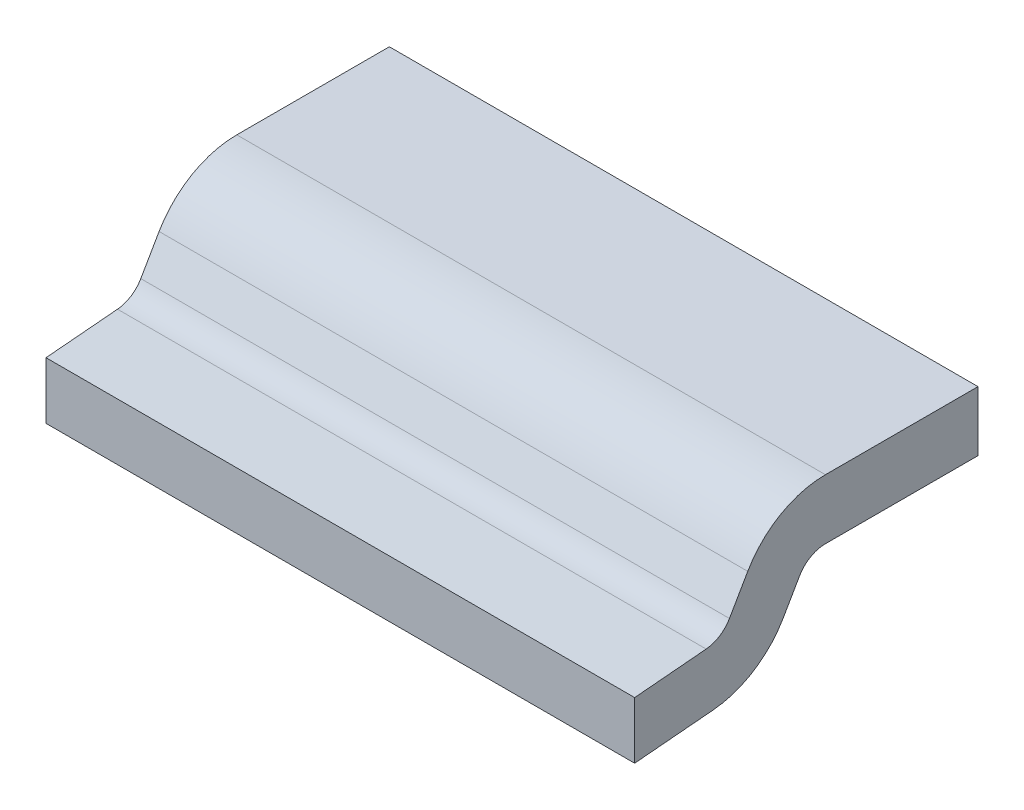
ISO-10303-21;
HEADER;
FILE_DESCRIPTION(('STEP AP214'),'2;1');
FILE_NAME('part.step','',(''),(''),'','','');
FILE_SCHEMA(('AUTOMOTIVE_DESIGN { 1 0 10303 214 1 1 1 1 }'));
ENDSEC;
DATA;
#1=APPLICATION_CONTEXT('core data for automotive mechanical design processes');
#2=APPLICATION_PROTOCOL_DEFINITION('international standard','automotive_design',2000,#1);
#3=PRODUCT_CONTEXT('',#1,'mechanical');
#4=PRODUCT('Part','Part','',(#3));
#5=PRODUCT_RELATED_PRODUCT_CATEGORY('part','',(#4));
#6=PRODUCT_DEFINITION_FORMATION('','',#4);
#7=PRODUCT_DEFINITION_CONTEXT('part definition',#1,'design');
#8=PRODUCT_DEFINITION('design','',#6,#7);
#9=PRODUCT_DEFINITION_SHAPE('','',#8);
#10=(LENGTH_UNIT() NAMED_UNIT(*) SI_UNIT(.MILLI.,.METRE.));
#11=(NAMED_UNIT(*) PLANE_ANGLE_UNIT() SI_UNIT($,.RADIAN.));
#12=(NAMED_UNIT(*) SI_UNIT($,.STERADIAN.) SOLID_ANGLE_UNIT());
#13=UNCERTAINTY_MEASURE_WITH_UNIT(LENGTH_MEASURE(1.E-05),#10,'distance_accuracy_value','');
#14=(GEOMETRIC_REPRESENTATION_CONTEXT(3) GLOBAL_UNCERTAINTY_ASSIGNED_CONTEXT((#13)) GLOBAL_UNIT_ASSIGNED_CONTEXT((#10,
#11,#12)) REPRESENTATION_CONTEXT('',''));
#15=CARTESIAN_POINT('',(0.,0.,0.));
#16=DIRECTION('',(0.,0.,1.));
#17=DIRECTION('',(1.,0.,0.));
#18=AXIS2_PLACEMENT_3D('',#15,#16,#17);
#19=CARTESIAN_POINT('',(-1.5,0.223608840880857,0.398828461671254));
#20=DIRECTION('',(1.,0.,0.));
#21=DIRECTION('',(0.,-0.843391445812889,-0.537299608346818));
#22=AXIS2_PLACEMENT_3D('',#19,#20,#21);
#23=CYLINDRICAL_SURFACE('',#22,0.1524);
#24=CARTESIAN_POINT('',(-1.5,0.223608840880857,0.398828461671254));
#25=DIRECTION('',(-1.,0.,0.));
#26=DIRECTION('',(0.,-0.843391445812889,-0.537299608346818));
#27=AXIS2_PLACEMENT_3D('',#24,#25,#26);
#28=CIRCLE('',#27,0.1524);
#29=CARTESIAN_POINT('',(-1.5,0.147408840880837,0.266846190134476));
#30=VERTEX_POINT('',#29);
#31=CARTESIAN_POINT('',(-1.5,0.0717887688916677,0.385545926476509));
#32=VERTEX_POINT('',#31);
#33=EDGE_CURVE('E11',#30,#32,#28,.T.);
#34=ORIENTED_EDGE('',*,*,#33,.T.);
#35=DIRECTION('',(1.,0.,0.));
#36=VECTOR('',#35,1.);
#37=CARTESIAN_POINT('',(-1.5,0.0717887688916754,0.38554592647651));
#38=LINE('',#37,#36);
#39=CARTESIAN_POINT('',(1.5,0.0717887688916677,0.385545926476509));
#40=VERTEX_POINT('',#39);
#41=EDGE_CURVE('E24',#32,#40,#38,.T.);
#42=ORIENTED_EDGE('',*,*,#41,.T.);
#43=CARTESIAN_POINT('',(1.5,0.223608840880857,0.398828461671254));
#44=DIRECTION('',(1.,0.,0.));
#45=DIRECTION('',(0.,-0.843391445812889,-0.537299608346818));
#46=AXIS2_PLACEMENT_3D('',#43,#44,#45);
#47=CIRCLE('',#46,0.1524);
#48=CARTESIAN_POINT('',(1.5,0.147408840880838,0.266846190134478));
#49=VERTEX_POINT('',#48);
#50=EDGE_CURVE('E202',#40,#49,#47,.T.);
#51=ORIENTED_EDGE('',*,*,#50,.T.);
#52=DIRECTION('',(-1.,0.,0.));
#53=VECTOR('',#52,1.);
#54=CARTESIAN_POINT('',(-1.5,0.147408840880855,0.266846190134507));
#55=LINE('',#54,#53);
#56=EDGE_CURVE('E36',#49,#30,#55,.T.);
#57=ORIENTED_EDGE('',*,*,#56,.T.);
#58=EDGE_LOOP('',(#34,#42,#51,#57));
#59=FACE_BOUND('',#58,.T.);
#60=ADVANCED_FACE('F17',(#59),#23,.F.);
#61=CARTESIAN_POINT('',(-1.5,0.0796796527909721,0.295352710792537));
#62=DIRECTION('',(0.,0.996194698091745,0.087155742747664));
#63=DIRECTION('',(0.,-0.087155742747664,0.996194698091745));
#64=AXIS2_PLACEMENT_3D('',#61,#62,#63);
#65=PLANE('',#64);
#66=ORIENTED_EDGE('',*,*,#41,.F.);
#67=DIRECTION('',(0.,-0.087155742747664,0.996194698091745));
#68=VECTOR('',#67,1.);
#69=CARTESIAN_POINT('',(-1.5,0.0727652026207921,0.374385237882437));
#70=LINE('',#69,#68);
#71=CARTESIAN_POINT('',(-1.5,0.0399031690825243,0.75));
#72=VERTEX_POINT('',#71);
#73=EDGE_CURVE('E199',#32,#72,#70,.T.);
#74=ORIENTED_EDGE('',*,*,#73,.T.);
#75=DIRECTION('',(-1.,0.,0.));
#76=VECTOR('',#75,1.);
#77=CARTESIAN_POINT('',(0.15,0.0399031690825243,0.75));
#78=LINE('',#77,#76);
#79=CARTESIAN_POINT('',(1.5,0.0399031690825165,0.75));
#80=VERTEX_POINT('',#79);
#81=EDGE_CURVE('E196',#80,#72,#78,.T.);
#82=ORIENTED_EDGE('',*,*,#81,.F.);
#83=DIRECTION('',(0.,-0.087155742747664,0.996194698091745));
#84=VECTOR('',#83,1.);
#85=CARTESIAN_POINT('',(1.5,0.0727652026207921,0.374385237882437));
#86=LINE('',#85,#84);
#87=EDGE_CURVE('E194',#40,#80,#86,.T.);
#88=ORIENTED_EDGE('',*,*,#87,.F.);
#89=EDGE_LOOP('',(#66,#74,#82,#88));
#90=FACE_BOUND('',#89,.T.);
#91=ADVANCED_FACE('F204',(#90),#65,.T.);
#92=CARTESIAN_POINT('',(-1.5,0.,0.));
#93=DIRECTION('',(1.,0.,0.));
#94=DIRECTION('',(0.,0.,-1.));
#95=AXIS2_PLACEMENT_3D('',#92,#93,#94);
#96=PLANE('',#95);
#97=DIRECTION('',(0.,0.866025403784429,-0.500000000000017));
#98=VECTOR('',#97,1.);
#99=CARTESIAN_POINT('',(-1.5,0.1643243897794,0.2570799934244));
#100=LINE('',#99,#98);
#101=CARTESIAN_POINT('',(-1.5,0.3088,0.1736669609722));
#102=VERTEX_POINT('',#101);
#103=EDGE_CURVE('E192',#30,#102,#100,.T.);
#104=ORIENTED_EDGE('',*,*,#103,.T.);
#105=CARTESIAN_POINT('',(-1.5,0.0802,-0.222279853638));
#106=DIRECTION('',(-1.,0.,0.));
#107=DIRECTION('',(0.,0.500000000000017,0.866025403784429));
#108=AXIS2_PLACEMENT_3D('',#105,#106,#107);
#109=CIRCLE('',#108,0.4572);
#110=CARTESIAN_POINT('',(-1.5,0.5374,-0.222279853638));
#111=VERTEX_POINT('',#110);
#112=EDGE_CURVE('E190',#102,#111,#109,.T.);
#113=ORIENTED_EDGE('',*,*,#112,.T.);
#114=DIRECTION('',(0.,0.,1.));
#115=VECTOR('',#114,1.);
#116=CARTESIAN_POINT('',(-1.5,0.5374,-0.9998));
#117=LINE('',#116,#115);
#118=CARTESIAN_POINT('',(-1.5,0.5374,-0.9998));
#119=VERTEX_POINT('',#118);
#120=EDGE_CURVE('E187',#119,#111,#117,.T.);
#121=ORIENTED_EDGE('',*,*,#120,.F.);
#122=DIRECTION('',(0.,1.,0.));
#123=VECTOR('',#122,1.);
#124=CARTESIAN_POINT('',(-1.5,0.2326,-0.9998));
#125=LINE('',#124,#123);
#126=CARTESIAN_POINT('',(-1.5,0.2326,-0.9998));
#127=VERTEX_POINT('',#126);
#128=EDGE_CURVE('E184',#127,#119,#125,.T.);
#129=ORIENTED_EDGE('',*,*,#128,.F.);
#130=DIRECTION('',(0.,0.,-1.));
#131=VECTOR('',#130,1.);
#132=CARTESIAN_POINT('',(-1.5,0.2326,-0.222279853638));
#133=LINE('',#132,#131);
#134=CARTESIAN_POINT('',(-1.5,0.2326,-0.222279853638));
#135=VERTEX_POINT('',#134);
#136=EDGE_CURVE('E181',#135,#127,#133,.T.);
#137=ORIENTED_EDGE('',*,*,#136,.F.);
#138=CARTESIAN_POINT('',(-1.5,0.0802,-0.222279853638));
#139=DIRECTION('',(1.,0.,0.));
#140=DIRECTION('',(0.,1.,0.));
#141=AXIS2_PLACEMENT_3D('',#138,#139,#140);
#142=CIRCLE('',#141,0.1524);
#143=CARTESIAN_POINT('',(-1.5,0.1564,-0.09029758210126));
#144=VERTEX_POINT('',#143);
#145=EDGE_CURVE('E179',#135,#144,#142,.T.);
#146=ORIENTED_EDGE('',*,*,#145,.T.);
#147=DIRECTION('',(0.,-0.866025403784429,0.500000000000017));
#148=VECTOR('',#147,1.);
#149=CARTESIAN_POINT('',(-1.5,0.1564,-0.09029758210126));
#150=LINE('',#149,#148);
#151=CARTESIAN_POINT('',(-1.5,0.01192438977944,-0.006884549649082));
#152=VERTEX_POINT('',#151);
#153=EDGE_CURVE('E177',#144,#152,#150,.T.);
#154=ORIENTED_EDGE('',*,*,#153,.T.);
#155=CARTESIAN_POINT('',(-1.5,0.2405243897794,0.3890622649612));
#156=DIRECTION('',(-1.,0.,0.));
#157=DIRECTION('',(0.,-0.500000000000017,-0.866025403784429));
#158=AXIS2_PLACEMENT_3D('',#155,#156,#157);
#159=CIRCLE('',#158,0.4572);
#160=CARTESIAN_POINT('',(-1.5,-0.2149358261881,0.3492146593769));
#161=VERTEX_POINT('',#160);
#162=EDGE_CURVE('E175',#152,#161,#159,.T.);
#163=ORIENTED_EDGE('',*,*,#162,.T.);
#164=DIRECTION('',(0.,0.087155742747664,-0.996194698091745));
#165=VECTOR('',#164,1.);
#166=CARTESIAN_POINT('',(-1.5,-0.25,0.75));
#167=LINE('',#166,#165);
#168=CARTESIAN_POINT('',(-1.5,-0.25,0.75));
#169=VERTEX_POINT('',#168);
#170=EDGE_CURVE('E129',#169,#161,#167,.T.);
#171=ORIENTED_EDGE('',*,*,#170,.F.);
#172=DIRECTION('',(0.,1.,0.));
#173=VECTOR('',#172,1.);
#174=CARTESIAN_POINT('',(-1.5,-0.25,0.75));
#175=LINE('',#174,#173);
#176=EDGE_CURVE('E171',#169,#72,#175,.T.);
#177=ORIENTED_EDGE('',*,*,#176,.T.);
#178=ORIENTED_EDGE('',*,*,#73,.F.);
#179=ORIENTED_EDGE('',*,*,#33,.F.);
#180=EDGE_LOOP('',(#104,#113,#121,#129,#137,#146,#154,#163,#171,#177,#178,#179));
#181=FACE_BOUND('',#180,.T.);
#182=ADVANCED_FACE('F209',(#181),#96,.F.);
#183=CARTESIAN_POINT('',(-1.5,0.1524,0.2639645430735));
#184=DIRECTION('',(0.,0.500000000000017,0.866025403784429));
#185=DIRECTION('',(0.,-0.866025403784429,0.500000000000017));
#186=AXIS2_PLACEMENT_3D('',#183,#184,#185);
#187=PLANE('',#186);
#188=ORIENTED_EDGE('',*,*,#56,.F.);
#189=DIRECTION('',(0.,-0.866025403784429,0.500000000000017));
#190=VECTOR('',#189,1.);
#191=CARTESIAN_POINT('',(1.5,0.3088,0.1736669609722));
#192=LINE('',#191,#190);
#193=CARTESIAN_POINT('',(1.5,0.3088,0.1736669609722));
#194=VERTEX_POINT('',#193);
#195=EDGE_CURVE('E169',#194,#49,#192,.T.);
#196=ORIENTED_EDGE('',*,*,#195,.F.);
#197=DIRECTION('',(1.,0.,0.));
#198=VECTOR('',#197,1.);
#199=CARTESIAN_POINT('',(-1.5,0.3088,0.1736669609722));
#200=LINE('',#199,#198);
#201=EDGE_CURVE('E166',#102,#194,#200,.T.);
#202=ORIENTED_EDGE('',*,*,#201,.F.);
#203=ORIENTED_EDGE('',*,*,#103,.F.);
#204=EDGE_LOOP('',(#188,#196,#202,#203));
#205=FACE_BOUND('',#204,.T.);
#206=ADVANCED_FACE('F235',(#205),#187,.T.);
#207=CARTESIAN_POINT('',(1.8,-0.25,0.75));
#208=DIRECTION('',(0.,0.,-1.));
#209=DIRECTION('',(0.,1.,0.));
#210=AXIS2_PLACEMENT_3D('',#207,#208,#209);
#211=PLANE('',#210);
#212=ORIENTED_EDGE('',*,*,#176,.F.);
#213=DIRECTION('',(1.,0.,0.));
#214=VECTOR('',#213,1.);
#215=CARTESIAN_POINT('',(-1.5,-0.25,0.75));
#216=LINE('',#215,#214);
#217=CARTESIAN_POINT('',(1.5,-0.25,0.75));
#218=VERTEX_POINT('',#217);
#219=EDGE_CURVE('E164',#169,#218,#216,.T.);
#220=ORIENTED_EDGE('',*,*,#219,.T.);
#221=DIRECTION('',(0.,1.,0.));
#222=VECTOR('',#221,1.);
#223=CARTESIAN_POINT('',(1.5,-0.25,0.75));
#224=LINE('',#223,#222);
#225=EDGE_CURVE('E113',#218,#80,#224,.T.);
#226=ORIENTED_EDGE('',*,*,#225,.T.);
#227=ORIENTED_EDGE('',*,*,#81,.T.);
#228=EDGE_LOOP('',(#212,#220,#226,#227));
#229=FACE_BOUND('',#228,.T.);
#230=ADVANCED_FACE('F207',(#229),#211,.F.);
#231=CARTESIAN_POINT('',(-1.5,0.0802,-0.222279853638));
#232=DIRECTION('',(-1.,0.,0.));
#233=DIRECTION('',(0.,0.500000000000017,0.866025403784429));
#234=AXIS2_PLACEMENT_3D('',#231,#232,#233);
#235=CYLINDRICAL_SURFACE('',#234,0.4572);
#236=ORIENTED_EDGE('',*,*,#201,.T.);
#237=CARTESIAN_POINT('',(1.5,0.0802,-0.222279853638));
#238=DIRECTION('',(-1.,0.,0.));
#239=DIRECTION('',(0.,0.500000000000017,0.866025403784429));
#240=AXIS2_PLACEMENT_3D('',#237,#238,#239);
#241=CIRCLE('',#240,0.4572);
#242=CARTESIAN_POINT('',(1.5,0.5374,-0.222279853638));
#243=VERTEX_POINT('',#242);
#244=EDGE_CURVE('E161',#194,#243,#241,.T.);
#245=ORIENTED_EDGE('',*,*,#244,.T.);
#246=DIRECTION('',(1.,0.,0.));
#247=VECTOR('',#246,1.);
#248=CARTESIAN_POINT('',(-1.5,0.5374,-0.222279853638));
#249=LINE('',#248,#247);
#250=EDGE_CURVE('E158',#111,#243,#249,.T.);
#251=ORIENTED_EDGE('',*,*,#250,.F.);
#252=ORIENTED_EDGE('',*,*,#112,.F.);
#253=EDGE_LOOP('',(#236,#245,#251,#252));
#254=FACE_BOUND('',#253,.T.);
#255=ADVANCED_FACE('F231',(#254),#235,.T.);
#256=CARTESIAN_POINT('',(-1.5,0.5374,-0.9998));
#257=DIRECTION('',(0.,1.,0.));
#258=DIRECTION('',(0.,0.,1.));
#259=AXIS2_PLACEMENT_3D('',#256,#257,#258);
#260=PLANE('',#259);
#261=ORIENTED_EDGE('',*,*,#120,.T.);
#262=ORIENTED_EDGE('',*,*,#250,.T.);
#263=DIRECTION('',(0.,0.,1.));
#264=VECTOR('',#263,1.);
#265=CARTESIAN_POINT('',(1.5,0.5374,-0.9998));
#266=LINE('',#265,#264);
#267=CARTESIAN_POINT('',(1.5,0.5374,-0.9998));
#268=VERTEX_POINT('',#267);
#269=EDGE_CURVE('E155',#268,#243,#266,.T.);
#270=ORIENTED_EDGE('',*,*,#269,.F.);
#271=DIRECTION('',(1.,0.,0.));
#272=VECTOR('',#271,1.);
#273=CARTESIAN_POINT('',(-1.5,0.5374,-0.9998));
#274=LINE('',#273,#272);
#275=EDGE_CURVE('E152',#119,#268,#274,.T.);
#276=ORIENTED_EDGE('',*,*,#275,.F.);
#277=EDGE_LOOP('',(#261,#262,#270,#276));
#278=FACE_BOUND('',#277,.T.);
#279=ADVANCED_FACE('F227',(#278),#260,.T.);
#280=CARTESIAN_POINT('',(-1.5,0.2326,-0.9998));
#281=DIRECTION('',(0.,0.,-1.));
#282=DIRECTION('',(0.,1.,0.));
#283=AXIS2_PLACEMENT_3D('',#280,#281,#282);
#284=PLANE('',#283);
#285=ORIENTED_EDGE('',*,*,#128,.T.);
#286=ORIENTED_EDGE('',*,*,#275,.T.);
#287=DIRECTION('',(0.,1.,0.));
#288=VECTOR('',#287,1.);
#289=CARTESIAN_POINT('',(1.5,0.2326,-0.9998));
#290=LINE('',#289,#288);
#291=CARTESIAN_POINT('',(1.5,0.2326,-0.9998));
#292=VERTEX_POINT('',#291);
#293=EDGE_CURVE('E149',#292,#268,#290,.T.);
#294=ORIENTED_EDGE('',*,*,#293,.F.);
#295=DIRECTION('',(1.,0.,0.));
#296=VECTOR('',#295,1.);
#297=CARTESIAN_POINT('',(-1.5,0.2326,-0.9998));
#298=LINE('',#297,#296);
#299=EDGE_CURVE('E146',#127,#292,#298,.T.);
#300=ORIENTED_EDGE('',*,*,#299,.F.);
#301=EDGE_LOOP('',(#285,#286,#294,#300));
#302=FACE_BOUND('',#301,.T.);
#303=ADVANCED_FACE('F223',(#302),#284,.T.);
#304=CARTESIAN_POINT('',(-1.5,0.2326,-0.1342916726135));
#305=DIRECTION('',(0.,-1.,0.));
#306=DIRECTION('',(0.,0.,-1.));
#307=AXIS2_PLACEMENT_3D('',#304,#305,#306);
#308=PLANE('',#307);
#309=ORIENTED_EDGE('',*,*,#136,.T.);
#310=ORIENTED_EDGE('',*,*,#299,.T.);
#311=DIRECTION('',(0.,0.,-1.));
#312=VECTOR('',#311,1.);
#313=CARTESIAN_POINT('',(1.5,0.2326,-0.222279853638));
#314=LINE('',#313,#312);
#315=CARTESIAN_POINT('',(1.5,0.2326,-0.222279853638));
#316=VERTEX_POINT('',#315);
#317=EDGE_CURVE('E143',#316,#292,#314,.T.);
#318=ORIENTED_EDGE('',*,*,#317,.F.);
#319=DIRECTION('',(1.,0.,0.));
#320=VECTOR('',#319,1.);
#321=CARTESIAN_POINT('',(-1.5,0.2326,-0.222279853638));
#322=LINE('',#321,#320);
#323=EDGE_CURVE('E140',#135,#316,#322,.T.);
#324=ORIENTED_EDGE('',*,*,#323,.F.);
#325=EDGE_LOOP('',(#309,#310,#318,#324));
#326=FACE_BOUND('',#325,.T.);
#327=ADVANCED_FACE('F220',(#326),#308,.T.);
#328=CARTESIAN_POINT('',(-1.5,0.0802,-0.222279853638));
#329=DIRECTION('',(1.,0.,0.));
#330=DIRECTION('',(0.,1.,0.));
#331=AXIS2_PLACEMENT_3D('',#328,#329,#330);
#332=CYLINDRICAL_SURFACE('',#331,0.1524);
#333=ORIENTED_EDGE('',*,*,#323,.T.);
#334=CARTESIAN_POINT('',(1.5,0.0802,-0.222279853638));
#335=DIRECTION('',(1.,0.,0.));
#336=DIRECTION('',(0.,1.,0.));
#337=AXIS2_PLACEMENT_3D('',#334,#335,#336);
#338=CIRCLE('',#337,0.1524);
#339=CARTESIAN_POINT('',(1.5,0.1564,-0.09029758210126));
#340=VERTEX_POINT('',#339);
#341=EDGE_CURVE('E137',#316,#340,#338,.T.);
#342=ORIENTED_EDGE('',*,*,#341,.T.);
#343=DIRECTION('',(1.,0.,0.));
#344=VECTOR('',#343,1.);
#345=CARTESIAN_POINT('',(-1.5,0.1564,-0.09029758210126));
#346=LINE('',#345,#344);
#347=EDGE_CURVE('E135',#144,#340,#346,.T.);
#348=ORIENTED_EDGE('',*,*,#347,.F.);
#349=ORIENTED_EDGE('',*,*,#145,.F.);
#350=EDGE_LOOP('',(#333,#342,#348,#349));
#351=FACE_BOUND('',#350,.T.);
#352=ADVANCED_FACE('F216',(#351),#332,.F.);
#353=CARTESIAN_POINT('',(-1.5,-0.1941924756776,0.112117078107));
#354=DIRECTION('',(0.,-0.500000000000017,-0.866025403784429));
#355=DIRECTION('',(0.,0.866025403784429,-0.500000000000017));
#356=AXIS2_PLACEMENT_3D('',#353,#354,#355);
#357=PLANE('',#356);
#358=DIRECTION('',(0.,0.866025403784429,-0.500000000000017));
#359=VECTOR('',#358,1.);
#360=CARTESIAN_POINT('',(1.5,0.01192438977944,-0.006884549649082));
#361=LINE('',#360,#359);
#362=CARTESIAN_POINT('',(1.5,0.01192438977944,-0.006884549649082));
#363=VERTEX_POINT('',#362);
#364=EDGE_CURVE('E133',#363,#340,#361,.T.);
#365=ORIENTED_EDGE('',*,*,#364,.F.);
#366=DIRECTION('',(1.,0.,0.));
#367=VECTOR('',#366,1.);
#368=CARTESIAN_POINT('',(-1.5,0.01192438977944,-0.006884549649082));
#369=LINE('',#368,#367);
#370=EDGE_CURVE('E117',#152,#363,#369,.T.);
#371=ORIENTED_EDGE('',*,*,#370,.F.);
#372=ORIENTED_EDGE('',*,*,#153,.F.);
#373=ORIENTED_EDGE('',*,*,#347,.T.);
#374=EDGE_LOOP('',(#365,#371,#372,#373));
#375=FACE_BOUND('',#374,.T.);
#376=ADVANCED_FACE('F212',(#375),#357,.T.);
#377=CARTESIAN_POINT('',(1.5,0.,0.));
#378=DIRECTION('',(1.,0.,0.));
#379=DIRECTION('',(0.,0.,-1.));
#380=AXIS2_PLACEMENT_3D('',#377,#378,#379);
#381=PLANE('',#380);
#382=ORIENTED_EDGE('',*,*,#195,.T.);
#383=ORIENTED_EDGE('',*,*,#50,.F.);
#384=ORIENTED_EDGE('',*,*,#87,.T.);
#385=ORIENTED_EDGE('',*,*,#225,.F.);
#386=DIRECTION('',(0.,0.087155742747664,-0.996194698091745));
#387=VECTOR('',#386,1.);
#388=CARTESIAN_POINT('',(1.5,-0.25,0.75));
#389=LINE('',#388,#387);
#390=CARTESIAN_POINT('',(1.5,-0.2149358261881,0.3492146593769));
#391=VERTEX_POINT('',#390);
#392=EDGE_CURVE('E105',#218,#391,#389,.T.);
#393=ORIENTED_EDGE('',*,*,#392,.T.);
#394=CARTESIAN_POINT('',(1.5,0.2405243897794,0.3890622649612));
#395=DIRECTION('',(-1.,0.,0.));
#396=DIRECTION('',(0.,-0.500000000000017,-0.866025403784429));
#397=AXIS2_PLACEMENT_3D('',#394,#395,#396);
#398=CIRCLE('',#397,0.4572);
#399=EDGE_CURVE('E110',#363,#391,#398,.T.);
#400=ORIENTED_EDGE('',*,*,#399,.F.);
#401=ORIENTED_EDGE('',*,*,#364,.T.);
#402=ORIENTED_EDGE('',*,*,#341,.F.);
#403=ORIENTED_EDGE('',*,*,#317,.T.);
#404=ORIENTED_EDGE('',*,*,#293,.T.);
#405=ORIENTED_EDGE('',*,*,#269,.T.);
#406=ORIENTED_EDGE('',*,*,#244,.F.);
#407=EDGE_LOOP('',(#382,#383,#384,#385,#393,#400,#401,#402,#403,#404,#405,#406));
#408=FACE_BOUND('',#407,.T.);
#409=ADVANCED_FACE('F108',(#408),#381,.T.);
#410=CARTESIAN_POINT('',(-1.5,0.2405243897794,0.3890622649612));
#411=DIRECTION('',(-1.,0.,0.));
#412=DIRECTION('',(0.,-0.500000000000017,-0.866025403784429));
#413=AXIS2_PLACEMENT_3D('',#410,#411,#412);
#414=CYLINDRICAL_SURFACE('',#413,0.4572);
#415=ORIENTED_EDGE('',*,*,#370,.T.);
#416=ORIENTED_EDGE('',*,*,#399,.T.);
#417=DIRECTION('',(1.,0.,0.));
#418=VECTOR('',#417,1.);
#419=CARTESIAN_POINT('',(-1.5,-0.2149358261881,0.3492146593769));
#420=LINE('',#419,#418);
#421=EDGE_CURVE('E124',#161,#391,#420,.T.);
#422=ORIENTED_EDGE('',*,*,#421,.F.);
#423=ORIENTED_EDGE('',*,*,#162,.F.);
#424=EDGE_LOOP('',(#415,#416,#422,#423));
#425=FACE_BOUND('',#424,.T.);
#426=ADVANCED_FACE('F122',(#425),#414,.T.);
#427=CARTESIAN_POINT('',(-1.5,-0.25,0.75));
#428=DIRECTION('',(0.,-0.996194698091745,-0.087155742747664));
#429=DIRECTION('',(0.,0.087155742747664,-0.996194698091745));
#430=AXIS2_PLACEMENT_3D('',#427,#428,#429);
#431=PLANE('',#430);
#432=ORIENTED_EDGE('',*,*,#219,.F.);
#433=ORIENTED_EDGE('',*,*,#170,.T.);
#434=ORIENTED_EDGE('',*,*,#421,.T.);
#435=ORIENTED_EDGE('',*,*,#392,.F.);
#436=EDGE_LOOP('',(#432,#433,#434,#435));
#437=FACE_BOUND('',#436,.T.);
#438=ADVANCED_FACE('F128',(#437),#431,.T.);
#439=CLOSED_SHELL('',(#60,#91,#182,#206,#230,#255,#279,#303,#327,#352,#376,#409,#426,#438));
#440=MANIFOLD_SOLID_BREP('B1',#439);
#441=ADVANCED_BREP_SHAPE_REPRESENTATION('',(#18,#440),#14);
#442=SHAPE_DEFINITION_REPRESENTATION(#9,#441);
ENDSEC;
END-ISO-10303-21;
